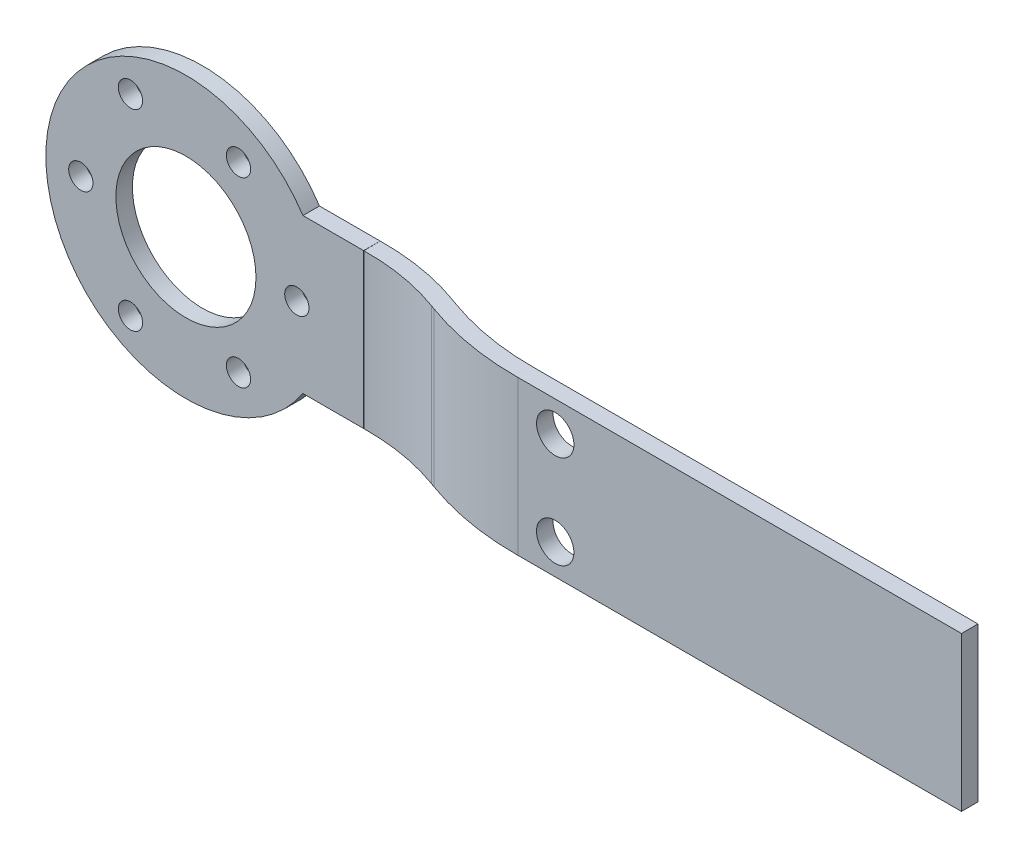
ISO-10303-21;
HEADER;
FILE_DESCRIPTION(('STEP AP214'),'2;1');
FILE_NAME('part.step','',(''),(''),'','','');
FILE_SCHEMA(('AUTOMOTIVE_DESIGN { 1 0 10303 214 1 1 1 1 }'));
ENDSEC;
DATA;
#1=APPLICATION_CONTEXT('core data for automotive mechanical design processes');
#2=APPLICATION_PROTOCOL_DEFINITION('international standard','automotive_design',2000,#1);
#3=PRODUCT_CONTEXT('',#1,'mechanical');
#4=PRODUCT('Part','Part','',(#3));
#5=PRODUCT_RELATED_PRODUCT_CATEGORY('part','',(#4));
#6=PRODUCT_DEFINITION_FORMATION('','',#4);
#7=PRODUCT_DEFINITION_CONTEXT('part definition',#1,'design');
#8=PRODUCT_DEFINITION('design','',#6,#7);
#9=PRODUCT_DEFINITION_SHAPE('','',#8);
#10=(LENGTH_UNIT() NAMED_UNIT(*) SI_UNIT(.MILLI.,.METRE.));
#11=(NAMED_UNIT(*) PLANE_ANGLE_UNIT() SI_UNIT($,.RADIAN.));
#12=(NAMED_UNIT(*) SI_UNIT($,.STERADIAN.) SOLID_ANGLE_UNIT());
#13=UNCERTAINTY_MEASURE_WITH_UNIT(LENGTH_MEASURE(1.E-05),#10,'distance_accuracy_value','');
#14=(GEOMETRIC_REPRESENTATION_CONTEXT(3) GLOBAL_UNCERTAINTY_ASSIGNED_CONTEXT((#13)) GLOBAL_UNIT_ASSIGNED_CONTEXT((#10,
#11,#12)) REPRESENTATION_CONTEXT('',''));
#15=CARTESIAN_POINT('',(0.,0.,0.));
#16=DIRECTION('',(0.,0.,1.));
#17=DIRECTION('',(1.,0.,0.));
#18=AXIS2_PLACEMENT_3D('',#15,#16,#17);
#19=CARTESIAN_POINT('',(25.0549396327351,-16.5,0.));
#20=DIRECTION('',(0.,-1.,0.));
#21=DIRECTION('',(0.,0.,-1.));
#22=AXIS2_PLACEMENT_3D('',#19,#20,#21);
#23=PLANE('',#22);
#24=CARTESIAN_POINT('',(77.5194023312404,-16.5,-51.1831946664342));
#25=DIRECTION('',(0.,-1.,0.));
#26=DIRECTION('',(0.,0.,-1.));
#27=AXIS2_PLACEMENT_3D('',#24,#25,#26);
#28=CIRCLE('',#27,58.1856592451566);
#29=CARTESIAN_POINT('',(78.0549396327351,-16.5,7.));
#30=VERTEX_POINT('',#29);
#31=CARTESIAN_POINT('',(57.6187348167134,-16.5,3.49343996180273));
#32=VERTEX_POINT('',#31);
#33=EDGE_CURVE('E56',#30,#32,#28,.T.);
#34=ORIENTED_EDGE('',*,*,#33,.F.);
#35=DIRECTION('',(-1.,0.,0.));
#36=VECTOR('',#35,1.);
#37=CARTESIAN_POINT('',(78.0549396327351,-16.5,7.));
#38=LINE('',#37,#36);
#39=CARTESIAN_POINT('',(173.054939632735,-16.5,7.));
#40=VERTEX_POINT('',#39);
#41=EDGE_CURVE('E156',#40,#30,#38,.T.);
#42=ORIENTED_EDGE('',*,*,#41,.F.);
#43=DIRECTION('',(0.,0.,-1.));
#44=VECTOR('',#43,1.);
#45=CARTESIAN_POINT('',(173.054939632735,-16.5,7.));
#46=LINE('',#45,#44);
#47=CARTESIAN_POINT('',(173.054939632735,-16.5,10.54));
#48=VERTEX_POINT('',#47);
#49=EDGE_CURVE('E160',#48,#40,#46,.T.);
#50=ORIENTED_EDGE('',*,*,#49,.F.);
#51=DIRECTION('',(1.,0.,0.));
#52=VECTOR('',#51,1.);
#53=CARTESIAN_POINT('',(78.0709904190798,-16.5,10.54));
#54=LINE('',#53,#52);
#55=CARTESIAN_POINT('',(78.0709904190798,-16.5,10.54));
#56=VERTEX_POINT('',#55);
#57=EDGE_CURVE('E164',#56,#48,#54,.T.);
#58=ORIENTED_EDGE('',*,*,#57,.F.);
#59=CARTESIAN_POINT('',(77.5194023312404,-16.5,-51.1831946664342));
#60=DIRECTION('',(0.,-1.,0.));
#61=DIRECTION('',(0.,0.,-1.));
#62=AXIS2_PLACEMENT_3D('',#59,#60,#61);
#63=CIRCLE('',#62,61.7256592451566);
#64=CARTESIAN_POINT('',(56.4079835093406,-16.5,6.81995183938485));
#65=VERTEX_POINT('',#64);
#66=EDGE_CURVE('E168',#65,#56,#63,.F.);
#67=ORIENTED_EDGE('',*,*,#66,.F.);
#68=DIRECTION('',(0.939692620785911,0.,0.342020143325663));
#69=VECTOR('',#68,1.);
#70=CARTESIAN_POINT('',(55.4969783145664,-16.5,6.48837306522519));
#71=LINE('',#70,#69);
#72=CARTESIAN_POINT('',(55.4969783145664,-16.5,6.48837306522519));
#73=VERTEX_POINT('',#72);
#74=EDGE_CURVE('E172',#73,#65,#71,.T.);
#75=ORIENTED_EDGE('',*,*,#74,.F.);
#76=CARTESIAN_POINT('',(38.7498432549536,-16.5,52.5007484820678));
#77=DIRECTION('',(0.,-1.,0.));
#78=DIRECTION('',(0.,0.,-1.));
#79=AXIS2_PLACEMENT_3D('',#76,#77,#78);
#80=CIRCLE('',#79,48.9653471774211);
#81=CARTESIAN_POINT('',(38.1017912193809,-16.5,3.539689948121));
#82=VERTEX_POINT('',#81);
#83=EDGE_CURVE('E176',#82,#73,#80,.T.);
#84=ORIENTED_EDGE('',*,*,#83,.F.);
#85=DIRECTION('',(0.0132349114818786,0.,0.999912414723443));
#86=VECTOR('',#85,1.);
#87=CARTESIAN_POINT('',(38.0549396327351,-16.5,0.));
#88=LINE('',#87,#86);
#89=CARTESIAN_POINT('',(38.0549396327351,-16.5,0.));
#90=VERTEX_POINT('',#89);
#91=EDGE_CURVE('E98',#90,#82,#88,.T.);
#92=ORIENTED_EDGE('',*,*,#91,.F.);
#93=CARTESIAN_POINT('',(38.7498432549536,-16.5,52.5007484820678));
#94=DIRECTION('',(0.,-1.,0.));
#95=DIRECTION('',(0.,0.,-1.));
#96=AXIS2_PLACEMENT_3D('',#93,#94,#95);
#97=CIRCLE('',#96,52.5053471774211);
#98=CARTESIAN_POINT('',(56.7077296219393,-16.5000000000001,3.16186118764308));
#99=VERTEX_POINT('',#98);
#100=EDGE_CURVE('E103',#99,#90,#97,.F.);
#101=ORIENTED_EDGE('',*,*,#100,.F.);
#102=DIRECTION('',(-0.93969262078591,0.,-0.342020143325665));
#103=VECTOR('',#102,1.);
#104=CARTESIAN_POINT('',(56.7077296219393,-16.5,3.16186118764308));
#105=LINE('',#104,#103);
#106=EDGE_CURVE('E136',#32,#99,#105,.T.);
#107=ORIENTED_EDGE('',*,*,#106,.F.);
#108=EDGE_LOOP('',(#34,#42,#50,#58,#67,#75,#84,#92,#101,#107));
#109=FACE_BOUND('',#108,.T.);
#110=ADVANCED_FACE('F47',(#109),#23,.T.);
#111=CARTESIAN_POINT('',(77.5194023312404,16.5,-51.1831946664342));
#112=DIRECTION('',(0.,-1.,0.));
#113=DIRECTION('',(0.,0.,-1.));
#114=AXIS2_PLACEMENT_3D('',#111,#112,#113);
#115=PLANE('',#114);
#116=CARTESIAN_POINT('',(77.5194023312404,16.5,-51.1831946664342));
#117=DIRECTION('',(0.,-1.,0.));
#118=DIRECTION('',(0.,0.,-1.));
#119=AXIS2_PLACEMENT_3D('',#116,#117,#118);
#120=CIRCLE('',#119,58.1856592451566);
#121=CARTESIAN_POINT('',(78.0549396327351,16.5,7.));
#122=VERTEX_POINT('',#121);
#123=CARTESIAN_POINT('',(57.6187348167134,16.5,3.49343996180273));
#124=VERTEX_POINT('',#123);
#125=EDGE_CURVE('E147',#122,#124,#120,.T.);
#126=ORIENTED_EDGE('',*,*,#125,.T.);
#127=DIRECTION('',(-0.93969262078591,0.,-0.342020143325665));
#128=VECTOR('',#127,1.);
#129=CARTESIAN_POINT('',(56.7077296219393,16.5,3.16186118764308));
#130=LINE('',#129,#128);
#131=CARTESIAN_POINT('',(56.7077296219393,16.5,3.16186118764308));
#132=VERTEX_POINT('',#131);
#133=EDGE_CURVE('E134',#124,#132,#130,.T.);
#134=ORIENTED_EDGE('',*,*,#133,.T.);
#135=CARTESIAN_POINT('',(38.7498432549536,16.5,52.5007484820678));
#136=DIRECTION('',(0.,1.,0.));
#137=DIRECTION('',(0.,0.,-1.));
#138=AXIS2_PLACEMENT_3D('',#135,#136,#137);
#139=CIRCLE('',#138,52.5053471774211);
#140=CARTESIAN_POINT('',(38.0549396327351,16.5,0.));
#141=VERTEX_POINT('',#140);
#142=EDGE_CURVE('E139',#132,#141,#139,.T.);
#143=ORIENTED_EDGE('',*,*,#142,.T.);
#144=DIRECTION('',(0.0132349114818786,0.,0.999912414723443));
#145=VECTOR('',#144,1.);
#146=CARTESIAN_POINT('',(38.0549396327351,16.5,0.));
#147=LINE('',#146,#145);
#148=CARTESIAN_POINT('',(38.101791219381,16.5,3.539689948121));
#149=VERTEX_POINT('',#148);
#150=EDGE_CURVE('E143',#141,#149,#147,.T.);
#151=ORIENTED_EDGE('',*,*,#150,.T.);
#152=CARTESIAN_POINT('',(38.7498432549536,16.5,52.5007484820678));
#153=DIRECTION('',(0.,-1.,0.));
#154=DIRECTION('',(0.,0.,-1.));
#155=AXIS2_PLACEMENT_3D('',#152,#153,#154);
#156=CIRCLE('',#155,48.9653471774211);
#157=CARTESIAN_POINT('',(55.4969783145664,16.5,6.48837306522519));
#158=VERTEX_POINT('',#157);
#159=EDGE_CURVE('E216',#149,#158,#156,.T.);
#160=ORIENTED_EDGE('',*,*,#159,.T.);
#161=DIRECTION('',(0.939692620785911,0.,0.342020143325663));
#162=VECTOR('',#161,1.);
#163=CARTESIAN_POINT('',(55.4969783145664,16.5,6.48837306522519));
#164=LINE('',#163,#162);
#165=CARTESIAN_POINT('',(56.4079835093406,16.5,6.81995183938485));
#166=VERTEX_POINT('',#165);
#167=EDGE_CURVE('E213',#158,#166,#164,.T.);
#168=ORIENTED_EDGE('',*,*,#167,.T.);
#169=CARTESIAN_POINT('',(77.5194023312404,16.5,-51.1831946664342));
#170=DIRECTION('',(0.,1.,0.));
#171=DIRECTION('',(0.,0.,-1.));
#172=AXIS2_PLACEMENT_3D('',#169,#170,#171);
#173=CIRCLE('',#172,61.7256592451566);
#174=CARTESIAN_POINT('',(78.0709904190798,16.5,10.54));
#175=VERTEX_POINT('',#174);
#176=EDGE_CURVE('E210',#166,#175,#173,.T.);
#177=ORIENTED_EDGE('',*,*,#176,.T.);
#178=DIRECTION('',(1.,0.,0.));
#179=VECTOR('',#178,1.);
#180=CARTESIAN_POINT('',(78.0709904190798,16.5,10.54));
#181=LINE('',#180,#179);
#182=CARTESIAN_POINT('',(173.054939632735,16.5,10.54));
#183=VERTEX_POINT('',#182);
#184=EDGE_CURVE('E207',#175,#183,#181,.T.);
#185=ORIENTED_EDGE('',*,*,#184,.T.);
#186=DIRECTION('',(0.,0.,-1.));
#187=VECTOR('',#186,1.);
#188=CARTESIAN_POINT('',(173.054939632735,16.5,7.));
#189=LINE('',#188,#187);
#190=CARTESIAN_POINT('',(173.054939632735,16.5,7.));
#191=VERTEX_POINT('',#190);
#192=EDGE_CURVE('E204',#183,#191,#189,.T.);
#193=ORIENTED_EDGE('',*,*,#192,.T.);
#194=DIRECTION('',(-1.,0.,0.));
#195=VECTOR('',#194,1.);
#196=CARTESIAN_POINT('',(78.0549396327351,16.5,7.));
#197=LINE('',#196,#195);
#198=EDGE_CURVE('E153',#191,#122,#197,.T.);
#199=ORIENTED_EDGE('',*,*,#198,.T.);
#200=EDGE_LOOP('',(#126,#134,#143,#151,#160,#168,#177,#185,#193,#199));
#201=FACE_BOUND('',#200,.T.);
#202=ADVANCED_FACE('F145',(#201),#115,.F.);
#203=CARTESIAN_POINT('',(56.7077296219393,-151.911375237486,3.16186118764308));
#204=DIRECTION('',(0.342020143325665,0.,-0.93969262078591));
#205=DIRECTION('',(-0.93969262078591,0.,-0.342020143325665));
#206=AXIS2_PLACEMENT_3D('',#203,#204,#205);
#207=PLANE('',#206);
#208=DIRECTION('',(0.,1.,0.));
#209=VECTOR('',#208,1.);
#210=CARTESIAN_POINT('',(57.6187348167134,-151.911375237486,3.49343996180273));
#211=LINE('',#210,#209);
#212=EDGE_CURVE('E12',#32,#124,#211,.T.);
#213=ORIENTED_EDGE('',*,*,#212,.F.);
#214=ORIENTED_EDGE('',*,*,#106,.T.);
#215=DIRECTION('',(0.,1.,0.));
#216=VECTOR('',#215,1.);
#217=CARTESIAN_POINT('',(56.7077296219393,-151.911375237486,3.16186118764308));
#218=LINE('',#217,#216);
#219=EDGE_CURVE('E131',#99,#132,#218,.T.);
#220=ORIENTED_EDGE('',*,*,#219,.T.);
#221=ORIENTED_EDGE('',*,*,#133,.F.);
#222=EDGE_LOOP('',(#213,#214,#220,#221));
#223=FACE_BOUND('',#222,.T.);
#224=ADVANCED_FACE('F132',(#223),#207,.T.);
#225=CARTESIAN_POINT('',(38.7498432549536,-151.911375237486,52.5007484820678));
#226=DIRECTION('',(0.,1.,0.));
#227=DIRECTION('',(0.,0.,1.));
#228=AXIS2_PLACEMENT_3D('',#225,#226,#227);
#229=CYLINDRICAL_SURFACE('',#228,52.5053471774211);
#230=ORIENTED_EDGE('',*,*,#219,.F.);
#231=ORIENTED_EDGE('',*,*,#100,.T.);
#232=DIRECTION('',(0.,1.,0.));
#233=VECTOR('',#232,1.);
#234=CARTESIAN_POINT('',(38.0549396327351,-151.911375237486,0.));
#235=LINE('',#234,#233);
#236=EDGE_CURVE('E126',#90,#141,#235,.T.);
#237=ORIENTED_EDGE('',*,*,#236,.T.);
#238=ORIENTED_EDGE('',*,*,#142,.F.);
#239=EDGE_LOOP('',(#230,#231,#237,#238));
#240=FACE_BOUND('',#239,.T.);
#241=ADVANCED_FACE('F140',(#240),#229,.T.);
#242=CARTESIAN_POINT('',(38.0549396327351,-151.911375237486,0.));
#243=DIRECTION('',(-0.999912414723443,0.,0.0132349114818786));
#244=DIRECTION('',(0.0132349114818786,0.,0.999912414723443));
#245=AXIS2_PLACEMENT_3D('',#242,#243,#244);
#246=PLANE('',#245);
#247=ORIENTED_EDGE('',*,*,#236,.F.);
#248=ORIENTED_EDGE('',*,*,#91,.T.);
#249=DIRECTION('',(0.,1.,0.));
#250=VECTOR('',#249,1.);
#251=CARTESIAN_POINT('',(38.101791219381,-151.911375237486,3.539689948121));
#252=LINE('',#251,#250);
#253=EDGE_CURVE('E179',#82,#149,#252,.T.);
#254=ORIENTED_EDGE('',*,*,#253,.T.);
#255=ORIENTED_EDGE('',*,*,#150,.F.);
#256=EDGE_LOOP('',(#247,#248,#254,#255));
#257=FACE_BOUND('',#256,.T.);
#258=ADVANCED_FACE('F220',(#257),#246,.T.);
#259=CARTESIAN_POINT('',(38.7498432549536,-151.911375237486,52.5007484820678));
#260=DIRECTION('',(0.,1.,0.));
#261=DIRECTION('',(0.,0.,1.));
#262=AXIS2_PLACEMENT_3D('',#259,#260,#261);
#263=CYLINDRICAL_SURFACE('',#262,48.9653471774211);
#264=ORIENTED_EDGE('',*,*,#253,.F.);
#265=ORIENTED_EDGE('',*,*,#83,.T.);
#266=DIRECTION('',(0.,1.,0.));
#267=VECTOR('',#266,1.);
#268=CARTESIAN_POINT('',(55.4969783145664,-151.911375237486,6.48837306522519));
#269=LINE('',#268,#267);
#270=EDGE_CURVE('E175',#73,#158,#269,.T.);
#271=ORIENTED_EDGE('',*,*,#270,.T.);
#272=ORIENTED_EDGE('',*,*,#159,.F.);
#273=EDGE_LOOP('',(#264,#265,#271,#272));
#274=FACE_BOUND('',#273,.T.);
#275=ADVANCED_FACE('F223',(#274),#263,.F.);
#276=CARTESIAN_POINT('',(55.4969783145664,-151.911375237486,6.48837306522519));
#277=DIRECTION('',(-0.342020143325663,0.,0.939692620785911));
#278=DIRECTION('',(0.939692620785911,0.,0.342020143325663));
#279=AXIS2_PLACEMENT_3D('',#276,#277,#278);
#280=PLANE('',#279);
#281=ORIENTED_EDGE('',*,*,#270,.F.);
#282=ORIENTED_EDGE('',*,*,#74,.T.);
#283=DIRECTION('',(0.,1.,0.));
#284=VECTOR('',#283,1.);
#285=CARTESIAN_POINT('',(56.4079835093406,-151.911375237486,6.81995183938485));
#286=LINE('',#285,#284);
#287=EDGE_CURVE('E171',#65,#166,#286,.T.);
#288=ORIENTED_EDGE('',*,*,#287,.T.);
#289=ORIENTED_EDGE('',*,*,#167,.F.);
#290=EDGE_LOOP('',(#281,#282,#288,#289));
#291=FACE_BOUND('',#290,.T.);
#292=ADVANCED_FACE('F227',(#291),#280,.T.);
#293=CARTESIAN_POINT('',(77.5194023312404,-151.911375237486,-51.1831946664342));
#294=DIRECTION('',(0.,1.,0.));
#295=DIRECTION('',(0.,0.,1.));
#296=AXIS2_PLACEMENT_3D('',#293,#294,#295);
#297=CYLINDRICAL_SURFACE('',#296,61.7256592451566);
#298=ORIENTED_EDGE('',*,*,#287,.F.);
#299=ORIENTED_EDGE('',*,*,#66,.T.);
#300=DIRECTION('',(0.,1.,0.));
#301=VECTOR('',#300,1.);
#302=CARTESIAN_POINT('',(78.0709904190798,-151.911375237486,10.54));
#303=LINE('',#302,#301);
#304=EDGE_CURVE('E167',#56,#175,#303,.T.);
#305=ORIENTED_EDGE('',*,*,#304,.T.);
#306=ORIENTED_EDGE('',*,*,#176,.F.);
#307=EDGE_LOOP('',(#298,#299,#305,#306));
#308=FACE_BOUND('',#307,.T.);
#309=ADVANCED_FACE('F232',(#308),#297,.T.);
#310=CARTESIAN_POINT('',(78.0709904190798,-151.911375237486,10.54));
#311=DIRECTION('',(0.,0.,1.));
#312=DIRECTION('',(1.,0.,0.));
#313=AXIS2_PLACEMENT_3D('',#310,#311,#312);
#314=PLANE('',#313);
#315=CARTESIAN_POINT('',(86.0709904190798,10.,10.54));
#316=DIRECTION('',(0.,0.,1.));
#317=DIRECTION('',(1.,0.,0.));
#318=AXIS2_PLACEMENT_3D('',#315,#316,#317);
#319=CIRCLE('',#318,4.00000000000001);
#320=CARTESIAN_POINT('',(90.0709904190798,10.,10.54));
#321=VERTEX_POINT('',#320);
#322=EDGE_CURVE('E191',#321,#321,#319,.T.);
#323=ORIENTED_EDGE('',*,*,#322,.F.);
#324=EDGE_LOOP('',(#323));
#325=FACE_BOUND('',#324,.T.);
#326=CARTESIAN_POINT('',(86.0709904190798,-10.,10.54));
#327=DIRECTION('',(0.,0.,1.));
#328=DIRECTION('',(-1.,0.,0.));
#329=AXIS2_PLACEMENT_3D('',#326,#327,#328);
#330=CIRCLE('',#329,4.00000000000001);
#331=CARTESIAN_POINT('',(82.0709904190797,-10.,10.54));
#332=VERTEX_POINT('',#331);
#333=EDGE_CURVE('E196',#332,#332,#330,.T.);
#334=ORIENTED_EDGE('',*,*,#333,.F.);
#335=EDGE_LOOP('',(#334));
#336=FACE_BOUND('',#335,.T.);
#337=ORIENTED_EDGE('',*,*,#304,.F.);
#338=ORIENTED_EDGE('',*,*,#57,.T.);
#339=DIRECTION('',(0.,1.,0.));
#340=VECTOR('',#339,1.);
#341=CARTESIAN_POINT('',(173.054939632735,-151.911375237486,10.54));
#342=LINE('',#341,#340);
#343=EDGE_CURVE('E163',#48,#183,#342,.T.);
#344=ORIENTED_EDGE('',*,*,#343,.T.);
#345=ORIENTED_EDGE('',*,*,#184,.F.);
#346=EDGE_LOOP('',(#337,#338,#344,#345));
#347=FACE_BOUND('',#346,.T.);
#348=ADVANCED_FACE('F235',(#325,#336,#347),#314,.T.);
#349=CARTESIAN_POINT('',(173.054939632735,-151.911375237486,7.));
#350=DIRECTION('',(1.,0.,0.));
#351=DIRECTION('',(0.,0.,-1.));
#352=AXIS2_PLACEMENT_3D('',#349,#350,#351);
#353=PLANE('',#352);
#354=ORIENTED_EDGE('',*,*,#343,.F.);
#355=ORIENTED_EDGE('',*,*,#49,.T.);
#356=DIRECTION('',(0.,1.,0.));
#357=VECTOR('',#356,1.);
#358=CARTESIAN_POINT('',(173.054939632735,-151.911375237486,7.));
#359=LINE('',#358,#357);
#360=EDGE_CURVE('E159',#40,#191,#359,.T.);
#361=ORIENTED_EDGE('',*,*,#360,.T.);
#362=ORIENTED_EDGE('',*,*,#192,.F.);
#363=EDGE_LOOP('',(#354,#355,#361,#362));
#364=FACE_BOUND('',#363,.T.);
#365=ADVANCED_FACE('F239',(#364),#353,.T.);
#366=CARTESIAN_POINT('',(78.0549396327351,-151.911375237486,7.));
#367=DIRECTION('',(0.,0.,-1.));
#368=DIRECTION('',(-1.,0.,0.));
#369=AXIS2_PLACEMENT_3D('',#366,#367,#368);
#370=PLANE('',#369);
#371=CARTESIAN_POINT('',(86.0709904190798,10.,7.));
#372=DIRECTION('',(0.,0.,-1.));
#373=DIRECTION('',(-1.,0.,0.));
#374=AXIS2_PLACEMENT_3D('',#371,#372,#373);
#375=CIRCLE('',#374,4.00000000000001);
#376=CARTESIAN_POINT('',(82.0709904190797,10.,7.));
#377=VERTEX_POINT('',#376);
#378=EDGE_CURVE('E50',#377,#377,#375,.T.);
#379=ORIENTED_EDGE('',*,*,#378,.F.);
#380=EDGE_LOOP('',(#379));
#381=FACE_BOUND('',#380,.T.);
#382=CARTESIAN_POINT('',(86.0709904190798,-10.,7.));
#383=DIRECTION('',(0.,0.,-1.));
#384=DIRECTION('',(-1.,0.,0.));
#385=AXIS2_PLACEMENT_3D('',#382,#383,#384);
#386=CIRCLE('',#385,4.00000000000001);
#387=CARTESIAN_POINT('',(82.0709904190797,-10.,7.));
#388=VERTEX_POINT('',#387);
#389=EDGE_CURVE('E189',#388,#388,#386,.T.);
#390=ORIENTED_EDGE('',*,*,#389,.F.);
#391=EDGE_LOOP('',(#390));
#392=FACE_BOUND('',#391,.T.);
#393=ORIENTED_EDGE('',*,*,#360,.F.);
#394=ORIENTED_EDGE('',*,*,#41,.T.);
#395=DIRECTION('',(0.,1.,0.));
#396=VECTOR('',#395,1.);
#397=CARTESIAN_POINT('',(78.0549396327351,-151.911375237486,7.));
#398=LINE('',#397,#396);
#399=EDGE_CURVE('E155',#30,#122,#398,.T.);
#400=ORIENTED_EDGE('',*,*,#399,.T.);
#401=ORIENTED_EDGE('',*,*,#198,.F.);
#402=EDGE_LOOP('',(#393,#394,#400,#401));
#403=FACE_BOUND('',#402,.T.);
#404=ADVANCED_FACE('F243',(#381,#392,#403),#370,.T.);
#405=CARTESIAN_POINT('',(77.5194023312404,-151.911375237486,-51.1831946664342));
#406=DIRECTION('',(0.,1.,0.));
#407=DIRECTION('',(0.,0.,1.));
#408=AXIS2_PLACEMENT_3D('',#405,#406,#407);
#409=CYLINDRICAL_SURFACE('',#408,58.1856592451566);
#410=ORIENTED_EDGE('',*,*,#399,.F.);
#411=ORIENTED_EDGE('',*,*,#33,.T.);
#412=ORIENTED_EDGE('',*,*,#212,.T.);
#413=ORIENTED_EDGE('',*,*,#125,.F.);
#414=EDGE_LOOP('',(#410,#411,#412,#413));
#415=FACE_BOUND('',#414,.T.);
#416=ADVANCED_FACE('F245',(#415),#409,.F.);
#417=CARTESIAN_POINT('',(86.0709904190798,-10.,0.540000000000001));
#418=DIRECTION('',(0.,0.,1.));
#419=DIRECTION('',(1.,0.,0.));
#420=AXIS2_PLACEMENT_3D('',#417,#418,#419);
#421=CYLINDRICAL_SURFACE('',#420,4.00000000000001);
#422=ORIENTED_EDGE('',*,*,#389,.T.);
#423=EDGE_LOOP('',(#422));
#424=FACE_BOUND('',#423,.T.);
#425=ORIENTED_EDGE('',*,*,#333,.T.);
#426=EDGE_LOOP('',(#425));
#427=FACE_BOUND('',#426,.T.);
#428=ADVANCED_FACE('F247',(#424,#427),#421,.F.);
#429=CARTESIAN_POINT('',(86.0709904190798,10.,0.540000000000001));
#430=DIRECTION('',(0.,0.,1.));
#431=DIRECTION('',(1.,0.,0.));
#432=AXIS2_PLACEMENT_3D('',#429,#430,#431);
#433=CYLINDRICAL_SURFACE('',#432,4.00000000000001);
#434=ORIENTED_EDGE('',*,*,#378,.T.);
#435=EDGE_LOOP('',(#434));
#436=FACE_BOUND('',#435,.T.);
#437=ORIENTED_EDGE('',*,*,#322,.T.);
#438=EDGE_LOOP('',(#437));
#439=FACE_BOUND('',#438,.T.);
#440=ADVANCED_FACE('F253',(#436,#439),#433,.F.);
#441=CLOSED_SHELL('',(#110,#202,#224,#241,#258,#275,#292,#309,#348,#365,#404,#416,#428,#440));
#442=MANIFOLD_SOLID_BREP('B2',#441);
#443=CARTESIAN_POINT('',(0.,0.,3.54));
#444=DIRECTION('',(0.,0.,-1.));
#445=DIRECTION('',(-1.,0.,0.));
#446=AXIS2_PLACEMENT_3D('',#443,#444,#445);
#447=CYLINDRICAL_SURFACE('',#446,30.);
#448=CARTESIAN_POINT('',(0.,0.,3.54));
#449=DIRECTION('',(0.,0.,1.));
#450=DIRECTION('',(1.,0.,0.));
#451=AXIS2_PLACEMENT_3D('',#448,#449,#450);
#452=CIRCLE('',#451,30.);
#453=CARTESIAN_POINT('',(25.0549396327351,16.5,3.54));
#454=VERTEX_POINT('',#453);
#455=CARTESIAN_POINT('',(25.0549396327351,-16.5,3.54));
#456=VERTEX_POINT('',#455);
#457=EDGE_CURVE('E45',#454,#456,#452,.T.);
#458=ORIENTED_EDGE('',*,*,#457,.F.);
#459=DIRECTION('',(0.,0.,1.));
#460=VECTOR('',#459,1.);
#461=CARTESIAN_POINT('',(25.0549396327351,16.5,0.));
#462=LINE('',#461,#460);
#463=CARTESIAN_POINT('',(25.0549396327351,16.5,0.));
#464=VERTEX_POINT('',#463);
#465=EDGE_CURVE('E438',#464,#454,#462,.T.);
#466=ORIENTED_EDGE('',*,*,#465,.F.);
#467=CARTESIAN_POINT('',(0.,0.,0.));
#468=DIRECTION('',(0.,0.,1.));
#469=DIRECTION('',(1.,0.,0.));
#470=AXIS2_PLACEMENT_3D('',#467,#468,#469);
#471=CIRCLE('',#470,30.);
#472=CARTESIAN_POINT('',(25.0549396327351,-16.5,0.));
#473=VERTEX_POINT('',#472);
#474=EDGE_CURVE('E371',#464,#473,#471,.T.);
#475=ORIENTED_EDGE('',*,*,#474,.T.);
#476=DIRECTION('',(0.,0.,1.));
#477=VECTOR('',#476,1.);
#478=CARTESIAN_POINT('',(25.0549396327351,-16.5,0.));
#479=LINE('',#478,#477);
#480=EDGE_CURVE('E382',#473,#456,#479,.T.);
#481=ORIENTED_EDGE('',*,*,#480,.T.);
#482=EDGE_LOOP('',(#458,#466,#475,#481));
#483=FACE_BOUND('',#482,.T.);
#484=ADVANCED_FACE('F368',(#483),#447,.T.);
#485=CARTESIAN_POINT('',(0.,0.,3.54));
#486=DIRECTION('',(0.,0.,1.));
#487=DIRECTION('',(1.,0.,0.));
#488=AXIS2_PLACEMENT_3D('',#485,#486,#487);
#489=PLANE('',#488);
#490=CARTESIAN_POINT('',(-22.5,0.,3.54));
#491=DIRECTION('',(0.,0.,1.));
#492=DIRECTION('',(1.,0.,0.));
#493=AXIS2_PLACEMENT_3D('',#490,#491,#492);
#494=CIRCLE('',#493,2.6);
#495=CARTESIAN_POINT('',(-19.9,0.,3.54));
#496=VERTEX_POINT('',#495);
#497=EDGE_CURVE('E496',#496,#496,#494,.T.);
#498=ORIENTED_EDGE('',*,*,#497,.F.);
#499=EDGE_LOOP('',(#498));
#500=FACE_BOUND('',#499,.T.);
#501=CARTESIAN_POINT('',(-11.8749999999998,20.5681033398805,3.54));
#502=DIRECTION('',(0.,0.,1.));
#503=DIRECTION('',(1.,0.,0.));
#504=AXIS2_PLACEMENT_3D('',#501,#502,#503);
#505=CIRCLE('',#504,2.6);
#506=CARTESIAN_POINT('',(-9.27499999999981,20.5681033398805,3.54));
#507=VERTEX_POINT('',#506);
#508=EDGE_CURVE('E506',#507,#507,#505,.T.);
#509=ORIENTED_EDGE('',*,*,#508,.F.);
#510=EDGE_LOOP('',(#509));
#511=FACE_BOUND('',#510,.T.);
#512=CARTESIAN_POINT('',(11.2500000000001,19.4855715851498,3.54));
#513=DIRECTION('',(0.,0.,1.));
#514=DIRECTION('',(1.,0.,0.));
#515=AXIS2_PLACEMENT_3D('',#512,#513,#514);
#516=CIRCLE('',#515,2.6);
#517=CARTESIAN_POINT('',(13.8500000000001,19.4855715851498,3.54));
#518=VERTEX_POINT('',#517);
#519=EDGE_CURVE('E525',#518,#518,#516,.T.);
#520=ORIENTED_EDGE('',*,*,#519,.F.);
#521=EDGE_LOOP('',(#520));
#522=FACE_BOUND('',#521,.T.);
#523=CARTESIAN_POINT('',(11.2499999999998,-19.48557158515,3.54));
#524=DIRECTION('',(0.,0.,1.));
#525=DIRECTION('',(1.,0.,0.));
#526=AXIS2_PLACEMENT_3D('',#523,#524,#525);
#527=CIRCLE('',#526,2.6);
#528=CARTESIAN_POINT('',(13.8499999999998,-19.48557158515,3.54));
#529=VERTEX_POINT('',#528);
#530=EDGE_CURVE('E520',#529,#529,#527,.T.);
#531=ORIENTED_EDGE('',*,*,#530,.F.);
#532=EDGE_LOOP('',(#531));
#533=FACE_BOUND('',#532,.T.);
#534=CARTESIAN_POINT('',(23.75,0.,3.54));
#535=DIRECTION('',(0.,0.,1.));
#536=DIRECTION('',(1.,0.,0.));
#537=AXIS2_PLACEMENT_3D('',#534,#535,#536);
#538=CIRCLE('',#537,2.6);
#539=CARTESIAN_POINT('',(26.35,0.,3.54));
#540=VERTEX_POINT('',#539);
#541=EDGE_CURVE('E513',#540,#540,#538,.T.);
#542=ORIENTED_EDGE('',*,*,#541,.F.);
#543=EDGE_LOOP('',(#542));
#544=FACE_BOUND('',#543,.T.);
#545=CARTESIAN_POINT('',(-11.8750000000001,-20.5681033398804,3.54));
#546=DIRECTION('',(0.,0.,1.));
#547=DIRECTION('',(1.,0.,0.));
#548=AXIS2_PLACEMENT_3D('',#545,#546,#547);
#549=CIRCLE('',#548,2.6);
#550=CARTESIAN_POINT('',(-9.2750000000001,-20.5681033398804,3.54));
#551=VERTEX_POINT('',#550);
#552=EDGE_CURVE('E512',#551,#551,#549,.T.);
#553=ORIENTED_EDGE('',*,*,#552,.F.);
#554=EDGE_LOOP('',(#553));
#555=FACE_BOUND('',#554,.T.);
#556=CARTESIAN_POINT('',(0.,0.,3.54));
#557=DIRECTION('',(0.,0.,1.));
#558=DIRECTION('',(1.,0.,0.));
#559=AXIS2_PLACEMENT_3D('',#556,#557,#558);
#560=CIRCLE('',#559,15.);
#561=CARTESIAN_POINT('',(15.,0.,3.54));
#562=VERTEX_POINT('',#561);
#563=EDGE_CURVE('E500',#562,#562,#560,.T.);
#564=ORIENTED_EDGE('',*,*,#563,.F.);
#565=EDGE_LOOP('',(#564));
#566=FACE_BOUND('',#565,.T.);
#567=ORIENTED_EDGE('',*,*,#457,.T.);
#568=DIRECTION('',(1.,0.,0.));
#569=VECTOR('',#568,1.);
#570=CARTESIAN_POINT('',(25.0549396327351,-16.5,3.54));
#571=LINE('',#570,#569);
#572=CARTESIAN_POINT('',(38.0549396327351,-16.5,3.54));
#573=VERTEX_POINT('',#572);
#574=EDGE_CURVE('E435',#456,#573,#571,.T.);
#575=ORIENTED_EDGE('',*,*,#574,.T.);
#576=DIRECTION('',(0.,1.,0.));
#577=VECTOR('',#576,1.);
#578=CARTESIAN_POINT('',(38.0549396327351,16.5,3.54));
#579=LINE('',#578,#577);
#580=CARTESIAN_POINT('',(38.0549396327351,16.5,3.54));
#581=VERTEX_POINT('',#580);
#582=EDGE_CURVE('E411',#573,#581,#579,.T.);
#583=ORIENTED_EDGE('',*,*,#582,.T.);
#584=DIRECTION('',(-1.,0.,0.));
#585=VECTOR('',#584,1.);
#586=CARTESIAN_POINT('',(25.0549396327351,16.5,3.54));
#587=LINE('',#586,#585);
#588=EDGE_CURVE('E426',#581,#454,#587,.T.);
#589=ORIENTED_EDGE('',*,*,#588,.T.);
#590=EDGE_LOOP('',(#567,#575,#583,#589));
#591=FACE_BOUND('',#590,.T.);
#592=ADVANCED_FACE('F444',(#500,#511,#522,#533,#544,#555,#566,#591),#489,.T.);
#593=CARTESIAN_POINT('',(0.,0.,0.));
#594=DIRECTION('',(0.,0.,1.));
#595=DIRECTION('',(1.,0.,0.));
#596=AXIS2_PLACEMENT_3D('',#593,#594,#595);
#597=PLANE('',#596);
#598=CARTESIAN_POINT('',(-22.5,0.,0.));
#599=DIRECTION('',(0.,0.,1.));
#600=DIRECTION('',(1.,0.,0.));
#601=AXIS2_PLACEMENT_3D('',#598,#599,#600);
#602=CIRCLE('',#601,2.6);
#603=CARTESIAN_POINT('',(-19.9,0.,0.));
#604=VERTEX_POINT('',#603);
#605=EDGE_CURVE('E499',#604,#604,#602,.F.);
#606=ORIENTED_EDGE('',*,*,#605,.F.);
#607=EDGE_LOOP('',(#606));
#608=FACE_BOUND('',#607,.T.);
#609=CARTESIAN_POINT('',(-11.8749999999998,20.5681033398805,0.));
#610=DIRECTION('',(0.,0.,1.));
#611=DIRECTION('',(1.,0.,0.));
#612=AXIS2_PLACEMENT_3D('',#609,#610,#611);
#613=CIRCLE('',#612,2.6);
#614=CARTESIAN_POINT('',(-9.27499999999981,20.5681033398805,0.));
#615=VERTEX_POINT('',#614);
#616=EDGE_CURVE('E509',#615,#615,#613,.F.);
#617=ORIENTED_EDGE('',*,*,#616,.F.);
#618=EDGE_LOOP('',(#617));
#619=FACE_BOUND('',#618,.T.);
#620=CARTESIAN_POINT('',(11.2500000000001,19.4855715851498,0.));
#621=DIRECTION('',(0.,0.,1.));
#622=DIRECTION('',(1.,0.,0.));
#623=AXIS2_PLACEMENT_3D('',#620,#621,#622);
#624=CIRCLE('',#623,2.6);
#625=CARTESIAN_POINT('',(13.8500000000001,19.4855715851498,0.));
#626=VERTEX_POINT('',#625);
#627=EDGE_CURVE('E503',#626,#626,#624,.F.);
#628=ORIENTED_EDGE('',*,*,#627,.F.);
#629=EDGE_LOOP('',(#628));
#630=FACE_BOUND('',#629,.T.);
#631=CARTESIAN_POINT('',(11.2499999999998,-19.48557158515,0.));
#632=DIRECTION('',(0.,0.,1.));
#633=DIRECTION('',(1.,0.,0.));
#634=AXIS2_PLACEMENT_3D('',#631,#632,#633);
#635=CIRCLE('',#634,2.6);
#636=CARTESIAN_POINT('',(13.8499999999998,-19.48557158515,0.));
#637=VERTEX_POINT('',#636);
#638=EDGE_CURVE('E528',#637,#637,#635,.F.);
#639=ORIENTED_EDGE('',*,*,#638,.F.);
#640=EDGE_LOOP('',(#639));
#641=FACE_BOUND('',#640,.T.);
#642=CARTESIAN_POINT('',(23.75,0.,0.));
#643=DIRECTION('',(0.,0.,1.));
#644=DIRECTION('',(1.,0.,0.));
#645=AXIS2_PLACEMENT_3D('',#642,#643,#644);
#646=CIRCLE('',#645,2.6);
#647=CARTESIAN_POINT('',(26.35,0.,0.));
#648=VERTEX_POINT('',#647);
#649=EDGE_CURVE('E516',#648,#648,#646,.F.);
#650=ORIENTED_EDGE('',*,*,#649,.F.);
#651=EDGE_LOOP('',(#650));
#652=FACE_BOUND('',#651,.T.);
#653=CARTESIAN_POINT('',(-11.8750000000001,-20.5681033398804,0.));
#654=DIRECTION('',(0.,0.,1.));
#655=DIRECTION('',(1.,0.,0.));
#656=AXIS2_PLACEMENT_3D('',#653,#654,#655);
#657=CIRCLE('',#656,2.6);
#658=CARTESIAN_POINT('',(-9.2750000000001,-20.5681033398804,0.));
#659=VERTEX_POINT('',#658);
#660=EDGE_CURVE('E517',#659,#659,#657,.F.);
#661=ORIENTED_EDGE('',*,*,#660,.F.);
#662=EDGE_LOOP('',(#661));
#663=FACE_BOUND('',#662,.T.);
#664=CARTESIAN_POINT('',(0.,0.,0.));
#665=DIRECTION('',(0.,0.,1.));
#666=DIRECTION('',(1.,0.,0.));
#667=AXIS2_PLACEMENT_3D('',#664,#665,#666);
#668=CIRCLE('',#667,15.);
#669=CARTESIAN_POINT('',(15.,0.,0.));
#670=VERTEX_POINT('',#669);
#671=EDGE_CURVE('E431',#670,#670,#668,.F.);
#672=ORIENTED_EDGE('',*,*,#671,.F.);
#673=EDGE_LOOP('',(#672));
#674=FACE_BOUND('',#673,.T.);
#675=ORIENTED_EDGE('',*,*,#474,.F.);
#676=DIRECTION('',(-1.,0.,0.));
#677=VECTOR('',#676,1.);
#678=CARTESIAN_POINT('',(25.0549396327351,16.5,0.));
#679=LINE('',#678,#677);
#680=CARTESIAN_POINT('',(38.0549396327351,16.5,0.));
#681=VERTEX_POINT('',#680);
#682=EDGE_CURVE('E423',#681,#464,#679,.T.);
#683=ORIENTED_EDGE('',*,*,#682,.F.);
#684=DIRECTION('',(0.,1.,0.));
#685=VECTOR('',#684,1.);
#686=CARTESIAN_POINT('',(38.0549396327351,16.5,0.));
#687=LINE('',#686,#685);
#688=CARTESIAN_POINT('',(38.0549396327351,-16.5,0.));
#689=VERTEX_POINT('',#688);
#690=EDGE_CURVE('E408',#689,#681,#687,.T.);
#691=ORIENTED_EDGE('',*,*,#690,.F.);
#692=DIRECTION('',(1.,0.,0.));
#693=VECTOR('',#692,1.);
#694=CARTESIAN_POINT('',(25.0549396327351,-16.5,0.));
#695=LINE('',#694,#693);
#696=EDGE_CURVE('E421',#473,#689,#695,.T.);
#697=ORIENTED_EDGE('',*,*,#696,.F.);
#698=EDGE_LOOP('',(#675,#683,#691,#697));
#699=FACE_BOUND('',#698,.T.);
#700=ADVANCED_FACE('F420',(#608,#619,#630,#641,#652,#663,#674,#699),#597,.F.);
#701=CARTESIAN_POINT('',(25.0549396327351,16.5,0.));
#702=DIRECTION('',(0.,1.,0.));
#703=DIRECTION('',(0.,0.,1.));
#704=AXIS2_PLACEMENT_3D('',#701,#702,#703);
#705=PLANE('',#704);
#706=ORIENTED_EDGE('',*,*,#588,.F.);
#707=DIRECTION('',(0.,0.,1.));
#708=VECTOR('',#707,1.);
#709=CARTESIAN_POINT('',(38.0549396327351,16.5,0.));
#710=LINE('',#709,#708);
#711=EDGE_CURVE('E416',#681,#581,#710,.T.);
#712=ORIENTED_EDGE('',*,*,#711,.F.);
#713=ORIENTED_EDGE('',*,*,#682,.T.);
#714=ORIENTED_EDGE('',*,*,#465,.T.);
#715=EDGE_LOOP('',(#706,#712,#713,#714));
#716=FACE_BOUND('',#715,.T.);
#717=ADVANCED_FACE('F445',(#716),#705,.T.);
#718=CARTESIAN_POINT('',(38.0549396327351,16.5,0.));
#719=DIRECTION('',(1.,0.,0.));
#720=DIRECTION('',(0.,0.,-1.));
#721=AXIS2_PLACEMENT_3D('',#718,#719,#720);
#722=PLANE('',#721);
#723=ORIENTED_EDGE('',*,*,#582,.F.);
#724=DIRECTION('',(0.,0.,1.));
#725=VECTOR('',#724,1.);
#726=CARTESIAN_POINT('',(38.0549396327351,-16.5,0.));
#727=LINE('',#726,#725);
#728=EDGE_CURVE('E405',#689,#573,#727,.T.);
#729=ORIENTED_EDGE('',*,*,#728,.F.);
#730=ORIENTED_EDGE('',*,*,#690,.T.);
#731=ORIENTED_EDGE('',*,*,#711,.T.);
#732=EDGE_LOOP('',(#723,#729,#730,#731));
#733=FACE_BOUND('',#732,.T.);
#734=ADVANCED_FACE('F407',(#733),#722,.T.);
#735=CARTESIAN_POINT('',(25.0549396327351,-16.5,0.));
#736=DIRECTION('',(0.,-1.,0.));
#737=DIRECTION('',(0.,0.,-1.));
#738=AXIS2_PLACEMENT_3D('',#735,#736,#737);
#739=PLANE('',#738);
#740=ORIENTED_EDGE('',*,*,#574,.F.);
#741=ORIENTED_EDGE('',*,*,#480,.F.);
#742=ORIENTED_EDGE('',*,*,#696,.T.);
#743=ORIENTED_EDGE('',*,*,#728,.T.);
#744=EDGE_LOOP('',(#740,#741,#742,#743));
#745=FACE_BOUND('',#744,.T.);
#746=ADVANCED_FACE('F425',(#745),#739,.T.);
#747=CARTESIAN_POINT('',(0.,0.,-0.00100000000000013));
#748=DIRECTION('',(0.,0.,1.));
#749=DIRECTION('',(1.,0.,0.));
#750=AXIS2_PLACEMENT_3D('',#747,#748,#749);
#751=CYLINDRICAL_SURFACE('',#750,15.);
#752=ORIENTED_EDGE('',*,*,#563,.T.);
#753=EDGE_LOOP('',(#752));
#754=FACE_BOUND('',#753,.T.);
#755=ORIENTED_EDGE('',*,*,#671,.T.);
#756=EDGE_LOOP('',(#755));
#757=FACE_BOUND('',#756,.T.);
#758=ADVANCED_FACE('F461',(#754,#757),#751,.F.);
#759=CARTESIAN_POINT('',(-11.8750000000001,-20.5681033398804,-0.00100000000000013));
#760=DIRECTION('',(0.,0.,1.));
#761=DIRECTION('',(1.,0.,0.));
#762=AXIS2_PLACEMENT_3D('',#759,#760,#761);
#763=CYLINDRICAL_SURFACE('',#762,2.6);
#764=ORIENTED_EDGE('',*,*,#552,.T.);
#765=EDGE_LOOP('',(#764));
#766=FACE_BOUND('',#765,.T.);
#767=ORIENTED_EDGE('',*,*,#660,.T.);
#768=EDGE_LOOP('',(#767));
#769=FACE_BOUND('',#768,.T.);
#770=ADVANCED_FACE('F468',(#766,#769),#763,.F.);
#771=CARTESIAN_POINT('',(23.75,0.,-0.00100000000000013));
#772=DIRECTION('',(0.,0.,1.));
#773=DIRECTION('',(1.,0.,0.));
#774=AXIS2_PLACEMENT_3D('',#771,#772,#773);
#775=CYLINDRICAL_SURFACE('',#774,2.6);
#776=ORIENTED_EDGE('',*,*,#541,.T.);
#777=EDGE_LOOP('',(#776));
#778=FACE_BOUND('',#777,.T.);
#779=ORIENTED_EDGE('',*,*,#649,.T.);
#780=EDGE_LOOP('',(#779));
#781=FACE_BOUND('',#780,.T.);
#782=ADVANCED_FACE('F474',(#778,#781),#775,.F.);
#783=CARTESIAN_POINT('',(11.2499999999998,-19.48557158515,-0.00100000000000013));
#784=DIRECTION('',(0.,0.,1.));
#785=DIRECTION('',(1.,0.,0.));
#786=AXIS2_PLACEMENT_3D('',#783,#784,#785);
#787=CYLINDRICAL_SURFACE('',#786,2.6);
#788=ORIENTED_EDGE('',*,*,#530,.T.);
#789=EDGE_LOOP('',(#788));
#790=FACE_BOUND('',#789,.T.);
#791=ORIENTED_EDGE('',*,*,#638,.T.);
#792=EDGE_LOOP('',(#791));
#793=FACE_BOUND('',#792,.T.);
#794=ADVANCED_FACE('F470',(#790,#793),#787,.F.);
#795=CARTESIAN_POINT('',(11.2500000000001,19.4855715851498,-0.00100000000000013));
#796=DIRECTION('',(0.,0.,1.));
#797=DIRECTION('',(1.,0.,0.));
#798=AXIS2_PLACEMENT_3D('',#795,#796,#797);
#799=CYLINDRICAL_SURFACE('',#798,2.6);
#800=ORIENTED_EDGE('',*,*,#519,.T.);
#801=EDGE_LOOP('',(#800));
#802=FACE_BOUND('',#801,.T.);
#803=ORIENTED_EDGE('',*,*,#627,.T.);
#804=EDGE_LOOP('',(#803));
#805=FACE_BOUND('',#804,.T.);
#806=ADVANCED_FACE('F473',(#802,#805),#799,.F.);
#807=CARTESIAN_POINT('',(-11.8749999999998,20.5681033398805,-0.00100000000000013));
#808=DIRECTION('',(0.,0.,1.));
#809=DIRECTION('',(1.,0.,0.));
#810=AXIS2_PLACEMENT_3D('',#807,#808,#809);
#811=CYLINDRICAL_SURFACE('',#810,2.6);
#812=ORIENTED_EDGE('',*,*,#508,.T.);
#813=EDGE_LOOP('',(#812));
#814=FACE_BOUND('',#813,.T.);
#815=ORIENTED_EDGE('',*,*,#616,.T.);
#816=EDGE_LOOP('',(#815));
#817=FACE_BOUND('',#816,.T.);
#818=ADVANCED_FACE('F478',(#814,#817),#811,.F.);
#819=CARTESIAN_POINT('',(-22.5,0.,-0.00100000000000013));
#820=DIRECTION('',(0.,0.,1.));
#821=DIRECTION('',(1.,0.,0.));
#822=AXIS2_PLACEMENT_3D('',#819,#820,#821);
#823=CYLINDRICAL_SURFACE('',#822,2.6);
#824=ORIENTED_EDGE('',*,*,#497,.T.);
#825=EDGE_LOOP('',(#824));
#826=FACE_BOUND('',#825,.T.);
#827=ORIENTED_EDGE('',*,*,#605,.T.);
#828=EDGE_LOOP('',(#827));
#829=FACE_BOUND('',#828,.T.);
#830=ADVANCED_FACE('F488',(#826,#829),#823,.F.);
#831=CLOSED_SHELL('',(#484,#592,#700,#717,#734,#746,#758,#770,#782,#794,#806,#818,#830));
#832=MANIFOLD_SOLID_BREP('B6',#831);
#833=ADVANCED_BREP_SHAPE_REPRESENTATION('',(#18,#442,#832),#14);
#834=SHAPE_DEFINITION_REPRESENTATION(#9,#833);
ENDSEC;
END-ISO-10303-21;
